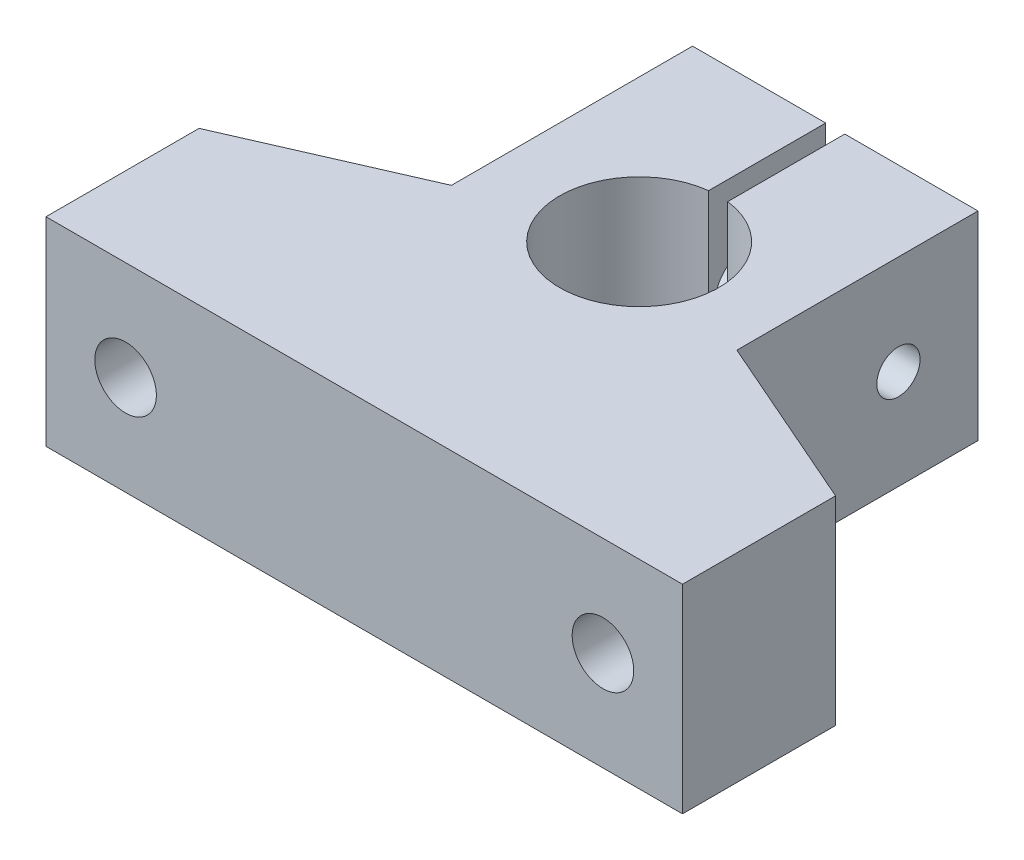
ISO-10303-21;
HEADER;
FILE_DESCRIPTION(('STEP AP214'),'2;1');
FILE_NAME('part.step','',(''),(''),'','','');
FILE_SCHEMA(('AUTOMOTIVE_DESIGN { 1 0 10303 214 1 1 1 1 }'));
ENDSEC;
DATA;
#1=APPLICATION_CONTEXT('core data for automotive mechanical design processes');
#2=APPLICATION_PROTOCOL_DEFINITION('international standard','automotive_design',2000,#1);
#3=PRODUCT_CONTEXT('',#1,'mechanical');
#4=PRODUCT('Part','Part','',(#3));
#5=PRODUCT_RELATED_PRODUCT_CATEGORY('part','',(#4));
#6=PRODUCT_DEFINITION_FORMATION('','',#4);
#7=PRODUCT_DEFINITION_CONTEXT('part definition',#1,'design');
#8=PRODUCT_DEFINITION('design','',#6,#7);
#9=PRODUCT_DEFINITION_SHAPE('','',#8);
#10=(LENGTH_UNIT() NAMED_UNIT(*) SI_UNIT(.MILLI.,.METRE.));
#11=(NAMED_UNIT(*) PLANE_ANGLE_UNIT() SI_UNIT($,.RADIAN.));
#12=(NAMED_UNIT(*) SI_UNIT($,.STERADIAN.) SOLID_ANGLE_UNIT());
#13=UNCERTAINTY_MEASURE_WITH_UNIT(LENGTH_MEASURE(1.E-05),#10,'distance_accuracy_value','');
#14=(GEOMETRIC_REPRESENTATION_CONTEXT(3) GLOBAL_UNCERTAINTY_ASSIGNED_CONTEXT((#13)) GLOBAL_UNIT_ASSIGNED_CONTEXT((#10,
#11,#12)) REPRESENTATION_CONTEXT('',''));
#15=CARTESIAN_POINT('',(0.,0.,0.));
#16=DIRECTION('',(0.,0.,1.));
#17=DIRECTION('',(1.,0.,0.));
#18=AXIS2_PLACEMENT_3D('',#15,#16,#17);
#19=CARTESIAN_POINT('',(-11.8368262810922,15.875,-27.9017324181359));
#20=DIRECTION('',(1.,0.,0.));
#21=DIRECTION('',(0.,0.,-1.));
#22=AXIS2_PLACEMENT_3D('',#19,#20,#21);
#23=PLANE('',#22);
#24=DIRECTION('',(0.,0.,1.));
#25=VECTOR('',#24,1.);
#26=CARTESIAN_POINT('',(-11.8368262810922,0.,-27.9017324181359));
#27=LINE('',#26,#25);
#28=CARTESIAN_POINT('',(-11.8368262810922,0.,-27.9017324181359));
#29=VERTEX_POINT('',#28);
#30=CARTESIAN_POINT('',(-11.8368262810922,0.,-8.65738618648675));
#31=VERTEX_POINT('',#30);
#32=EDGE_CURVE('E157',#29,#31,#27,.T.);
#33=ORIENTED_EDGE('',*,*,#32,.T.);
#34=DIRECTION('',(0.,-1.,0.));
#35=VECTOR('',#34,1.);
#36=CARTESIAN_POINT('',(-11.8368262810922,15.875,-8.65738618648675));
#37=LINE('',#36,#35);
#38=CARTESIAN_POINT('',(-11.8368262810922,15.875,-8.65738618648675));
#39=VERTEX_POINT('',#38);
#40=EDGE_CURVE('E11',#39,#31,#37,.T.);
#41=ORIENTED_EDGE('',*,*,#40,.F.);
#42=DIRECTION('',(0.,0.,1.));
#43=VECTOR('',#42,1.);
#44=CARTESIAN_POINT('',(-11.8368262810922,15.875,-27.9017324181359));
#45=LINE('',#44,#43);
#46=CARTESIAN_POINT('',(-11.8368262810922,15.875,-27.9017324181359));
#47=VERTEX_POINT('',#46);
#48=EDGE_CURVE('E180',#47,#39,#45,.T.);
#49=ORIENTED_EDGE('',*,*,#48,.F.);
#50=DIRECTION('',(0.,-1.,0.));
#51=VECTOR('',#50,1.);
#52=CARTESIAN_POINT('',(-11.8368262810922,15.875,-27.9017324181359));
#53=LINE('',#52,#51);
#54=EDGE_CURVE('E153',#47,#29,#53,.T.);
#55=ORIENTED_EDGE('',*,*,#54,.T.);
#56=EDGE_LOOP('',(#33,#41,#49,#55));
#57=FACE_BOUND('',#56,.T.);
#58=CARTESIAN_POINT('',(-11.8368262810922,7.9375,-21.5517324181359));
#59=DIRECTION('',(-1.,0.,0.));
#60=DIRECTION('',(0.,0.,1.));
#61=AXIS2_PLACEMENT_3D('',#58,#59,#60);
#62=CIRCLE('',#61,3.96875);
#63=CARTESIAN_POINT('',(-11.8368262810922,7.9375,-17.5829824181359));
#64=VERTEX_POINT('',#63);
#65=EDGE_CURVE('E205',#64,#64,#62,.T.);
#66=ORIENTED_EDGE('',*,*,#65,.F.);
#67=EDGE_LOOP('',(#66));
#68=FACE_BOUND('',#67,.T.);
#69=ADVANCED_FACE('F35',(#57,#68),#23,.F.);
#70=CARTESIAN_POINT('',(10.9469737189078,15.875,-27.9017324181359));
#71=DIRECTION('',(-1.,0.,0.));
#72=DIRECTION('',(0.,0.,1.));
#73=AXIS2_PLACEMENT_3D('',#70,#71,#72);
#74=PLANE('',#73);
#75=DIRECTION('',(0.,0.,-1.));
#76=VECTOR('',#75,1.);
#77=CARTESIAN_POINT('',(10.9469737189078,0.,-27.9017324181359));
#78=LINE('',#77,#76);
#79=CARTESIAN_POINT('',(10.9469737189078,0.,-8.65738618648675));
#80=VERTEX_POINT('',#79);
#81=CARTESIAN_POINT('',(10.9469737189078,0.,-27.9017324181359));
#82=VERTEX_POINT('',#81);
#83=EDGE_CURVE('E171',#80,#82,#78,.T.);
#84=ORIENTED_EDGE('',*,*,#83,.T.);
#85=DIRECTION('',(0.,-1.,0.));
#86=VECTOR('',#85,1.);
#87=CARTESIAN_POINT('',(10.9469737189078,15.875,-27.9017324181359));
#88=LINE('',#87,#86);
#89=CARTESIAN_POINT('',(10.9469737189078,15.875,-27.9017324181359));
#90=VERTEX_POINT('',#89);
#91=EDGE_CURVE('E187',#90,#82,#88,.T.);
#92=ORIENTED_EDGE('',*,*,#91,.F.);
#93=DIRECTION('',(0.,0.,-1.));
#94=VECTOR('',#93,1.);
#95=CARTESIAN_POINT('',(10.9469737189078,15.875,-27.9017324181359));
#96=LINE('',#95,#94);
#97=CARTESIAN_POINT('',(10.9469737189078,15.875,-8.65738618648675));
#98=VERTEX_POINT('',#97);
#99=EDGE_CURVE('E245',#98,#90,#96,.T.);
#100=ORIENTED_EDGE('',*,*,#99,.F.);
#101=DIRECTION('',(0.,-1.,0.));
#102=VECTOR('',#101,1.);
#103=CARTESIAN_POINT('',(10.9469737189078,15.875,-8.65738618648675));
#104=LINE('',#103,#102);
#105=EDGE_CURVE('E190',#98,#80,#104,.T.);
#106=ORIENTED_EDGE('',*,*,#105,.T.);
#107=EDGE_LOOP('',(#84,#92,#100,#106));
#108=FACE_BOUND('',#107,.T.);
#109=CARTESIAN_POINT('',(10.9469737189078,7.9375,-21.5517324181359));
#110=DIRECTION('',(1.,0.,0.));
#111=DIRECTION('',(0.,0.,-1.));
#112=AXIS2_PLACEMENT_3D('',#109,#110,#111);
#113=CIRCLE('',#112,1.72719999999999);
#114=CARTESIAN_POINT('',(10.9469737189078,7.9375,-23.2789324181359));
#115=VERTEX_POINT('',#114);
#116=EDGE_CURVE('E230',#115,#115,#113,.T.);
#117=ORIENTED_EDGE('',*,*,#116,.F.);
#118=EDGE_LOOP('',(#117));
#119=FACE_BOUND('',#118,.T.);
#120=ADVANCED_FACE('F278',(#108,#119),#74,.F.);
#121=CARTESIAN_POINT('',(-11.8368262810922,15.875,-8.65738618648675));
#122=DIRECTION('',(0.400932432781885,0.,0.916107627052411));
#123=DIRECTION('',(0.916107627052411,0.,-0.400932432781885));
#124=AXIS2_PLACEMENT_3D('',#121,#122,#123);
#125=PLANE('',#124);
#126=CARTESIAN_POINT('',(-19.4949262810922,7.9375,-5.30583602707377));
#127=DIRECTION('',(0.400932432781885,0.,0.916107627052411));
#128=DIRECTION('',(0.916107627052411,0.,-0.400932432781885));
#129=AXIS2_PLACEMENT_3D('',#126,#127,#128);
#130=ELLIPSE('',#129,4.33218748846083,3.96875);
#131=CARTESIAN_POINT('',(-15.5261762810922,7.9375,-7.04275049608962));
#132=VERTEX_POINT('',#131);
#133=EDGE_CURVE('E203',#132,#132,#130,.T.);
#134=ORIENTED_EDGE('',*,*,#133,.T.);
#135=EDGE_LOOP('',(#134));
#136=FACE_BOUND('',#135,.T.);
#137=DIRECTION('',(-0.916107627052411,0.,0.400932432781885));
#138=VECTOR('',#137,1.);
#139=CARTESIAN_POINT('',(-11.8368262810922,0.,-8.65738618648675));
#140=LINE('',#139,#138);
#141=CARTESIAN_POINT('',(-25.8449262810922,0.,-2.52677287664841));
#142=VERTEX_POINT('',#141);
#143=EDGE_CURVE('E160',#31,#142,#140,.T.);
#144=ORIENTED_EDGE('',*,*,#143,.T.);
#145=DIRECTION('',(0.,-1.,0.));
#146=VECTOR('',#145,1.);
#147=CARTESIAN_POINT('',(-25.8449262810922,15.875,-2.52677287664841));
#148=LINE('',#147,#146);
#149=CARTESIAN_POINT('',(-25.8449262810922,15.875,-2.52677287664841));
#150=VERTEX_POINT('',#149);
#151=EDGE_CURVE('E44',#150,#142,#148,.T.);
#152=ORIENTED_EDGE('',*,*,#151,.F.);
#153=DIRECTION('',(-0.916107627052411,0.,0.400932432781885));
#154=VECTOR('',#153,1.);
#155=CARTESIAN_POINT('',(-11.8368262810922,15.875,-8.65738618648675));
#156=LINE('',#155,#154);
#157=EDGE_CURVE('E108',#39,#150,#156,.T.);
#158=ORIENTED_EDGE('',*,*,#157,.F.);
#159=ORIENTED_EDGE('',*,*,#40,.T.);
#160=EDGE_LOOP('',(#144,#152,#158,#159));
#161=FACE_BOUND('',#160,.T.);
#162=ADVANCED_FACE('F282',(#136,#161),#125,.F.);
#163=CARTESIAN_POINT('',(-25.8449262810922,15.875,9.69026758186406));
#164=DIRECTION('',(1.,0.,0.));
#165=DIRECTION('',(0.,0.,-1.));
#166=AXIS2_PLACEMENT_3D('',#163,#164,#165);
#167=PLANE('',#166);
#168=DIRECTION('',(0.,0.,1.));
#169=VECTOR('',#168,1.);
#170=CARTESIAN_POINT('',(-25.8449262810922,0.,9.69026758186406));
#171=LINE('',#170,#169);
#172=CARTESIAN_POINT('',(-25.8449262810922,0.,9.69026758186406));
#173=VERTEX_POINT('',#172);
#174=EDGE_CURVE('E163',#142,#173,#171,.T.);
#175=ORIENTED_EDGE('',*,*,#174,.T.);
#176=DIRECTION('',(0.,-1.,0.));
#177=VECTOR('',#176,1.);
#178=CARTESIAN_POINT('',(-25.8449262810922,15.875,9.69026758186406));
#179=LINE('',#178,#177);
#180=CARTESIAN_POINT('',(-25.8449262810922,15.875,9.69026758186406));
#181=VERTEX_POINT('',#180);
#182=EDGE_CURVE('E199',#181,#173,#179,.T.);
#183=ORIENTED_EDGE('',*,*,#182,.F.);
#184=DIRECTION('',(0.,0.,1.));
#185=VECTOR('',#184,1.);
#186=CARTESIAN_POINT('',(-25.8449262810922,15.875,9.69026758186406));
#187=LINE('',#186,#185);
#188=EDGE_CURVE('E237',#150,#181,#187,.T.);
#189=ORIENTED_EDGE('',*,*,#188,.F.);
#190=ORIENTED_EDGE('',*,*,#151,.T.);
#191=EDGE_LOOP('',(#175,#183,#189,#190));
#192=FACE_BOUND('',#191,.T.);
#193=ADVANCED_FACE('F288',(#192),#167,.F.);
#194=CARTESIAN_POINT('',(-25.8449262810922,15.875,9.69026758186406));
#195=DIRECTION('',(0.,0.,-1.));
#196=DIRECTION('',(-1.,0.,0.));
#197=AXIS2_PLACEMENT_3D('',#194,#195,#196);
#198=PLANE('',#197);
#199=CARTESIAN_POINT('',(18.6050737189078,7.9375,9.69026758186406));
#200=DIRECTION('',(0.,0.,-1.));
#201=DIRECTION('',(-1.,0.,0.));
#202=AXIS2_PLACEMENT_3D('',#199,#200,#201);
#203=CIRCLE('',#202,2.45745);
#204=CARTESIAN_POINT('',(16.1476237189078,7.9375,9.69026758186406));
#205=VERTEX_POINT('',#204);
#206=EDGE_CURVE('E518',#205,#205,#203,.T.);
#207=ORIENTED_EDGE('',*,*,#206,.T.);
#208=EDGE_LOOP('',(#207));
#209=FACE_BOUND('',#208,.T.);
#210=CARTESIAN_POINT('',(-19.4949262810922,7.9375,9.69026758186406));
#211=DIRECTION('',(0.,0.,-1.));
#212=DIRECTION('',(-1.,0.,0.));
#213=AXIS2_PLACEMENT_3D('',#210,#211,#212);
#214=CIRCLE('',#213,2.45745);
#215=CARTESIAN_POINT('',(-21.9523762810922,7.9375,9.69026758186406));
#216=VERTEX_POINT('',#215);
#217=EDGE_CURVE('E206',#216,#216,#214,.T.);
#218=ORIENTED_EDGE('',*,*,#217,.T.);
#219=EDGE_LOOP('',(#218));
#220=FACE_BOUND('',#219,.T.);
#221=DIRECTION('',(1.,0.,0.));
#222=VECTOR('',#221,1.);
#223=CARTESIAN_POINT('',(-25.8449262810922,0.,9.69026758186406));
#224=LINE('',#223,#222);
#225=CARTESIAN_POINT('',(24.9550737189078,0.,9.69026758186406));
#226=VERTEX_POINT('',#225);
#227=EDGE_CURVE('E165',#173,#226,#224,.T.);
#228=ORIENTED_EDGE('',*,*,#227,.T.);
#229=DIRECTION('',(0.,-1.,0.));
#230=VECTOR('',#229,1.);
#231=CARTESIAN_POINT('',(24.9550737189078,15.875,9.69026758186406));
#232=LINE('',#231,#230);
#233=CARTESIAN_POINT('',(24.9550737189078,15.875,9.69026758186406));
#234=VERTEX_POINT('',#233);
#235=EDGE_CURVE('E196',#234,#226,#232,.T.);
#236=ORIENTED_EDGE('',*,*,#235,.F.);
#237=DIRECTION('',(1.,0.,0.));
#238=VECTOR('',#237,1.);
#239=CARTESIAN_POINT('',(-25.8449262810922,15.875,9.69026758186406));
#240=LINE('',#239,#238);
#241=EDGE_CURVE('E239',#181,#234,#240,.T.);
#242=ORIENTED_EDGE('',*,*,#241,.F.);
#243=ORIENTED_EDGE('',*,*,#182,.T.);
#244=EDGE_LOOP('',(#228,#236,#242,#243));
#245=FACE_BOUND('',#244,.T.);
#246=ADVANCED_FACE('F300',(#209,#220,#245),#198,.F.);
#247=CARTESIAN_POINT('',(24.9550737189078,15.875,9.69026758186406));
#248=DIRECTION('',(-1.,0.,0.));
#249=DIRECTION('',(0.,0.,1.));
#250=AXIS2_PLACEMENT_3D('',#247,#248,#249);
#251=PLANE('',#250);
#252=DIRECTION('',(0.,0.,-1.));
#253=VECTOR('',#252,1.);
#254=CARTESIAN_POINT('',(24.9550737189078,0.,9.69026758186406));
#255=LINE('',#254,#253);
#256=CARTESIAN_POINT('',(24.9550737189078,0.,-2.52677287664841));
#257=VERTEX_POINT('',#256);
#258=EDGE_CURVE('E167',#226,#257,#255,.T.);
#259=ORIENTED_EDGE('',*,*,#258,.T.);
#260=DIRECTION('',(0.,-1.,0.));
#261=VECTOR('',#260,1.);
#262=CARTESIAN_POINT('',(24.9550737189078,15.875,-2.52677287664841));
#263=LINE('',#262,#261);
#264=CARTESIAN_POINT('',(24.9550737189078,15.875,-2.52677287664841));
#265=VERTEX_POINT('',#264);
#266=EDGE_CURVE('E193',#265,#257,#263,.T.);
#267=ORIENTED_EDGE('',*,*,#266,.F.);
#268=DIRECTION('',(0.,0.,-1.));
#269=VECTOR('',#268,1.);
#270=CARTESIAN_POINT('',(24.9550737189078,15.875,9.69026758186406));
#271=LINE('',#270,#269);
#272=EDGE_CURVE('E241',#234,#265,#271,.T.);
#273=ORIENTED_EDGE('',*,*,#272,.F.);
#274=ORIENTED_EDGE('',*,*,#235,.T.);
#275=EDGE_LOOP('',(#259,#267,#273,#274));
#276=FACE_BOUND('',#275,.T.);
#277=ADVANCED_FACE('F296',(#276),#251,.F.);
#278=CARTESIAN_POINT('',(10.9469737189078,15.875,-8.65738618648675));
#279=DIRECTION('',(-0.400932432781885,0.,0.916107627052411));
#280=DIRECTION('',(0.916107627052411,0.,0.400932432781885));
#281=AXIS2_PLACEMENT_3D('',#278,#279,#280);
#282=PLANE('',#281);
#283=CARTESIAN_POINT('',(18.6050737189078,7.9375,-5.30583602707377));
#284=DIRECTION('',(-0.400932432781885,0.,0.916107627052411));
#285=DIRECTION('',(-0.916107627052411,0.,-0.400932432781885));
#286=AXIS2_PLACEMENT_3D('',#283,#284,#285);
#287=ELLIPSE('',#286,4.33218748846083,3.96875);
#288=CARTESIAN_POINT('',(14.6363237189078,7.9375,-7.04275049608962));
#289=VERTEX_POINT('',#288);
#290=EDGE_CURVE('E38',#289,#289,#287,.T.);
#291=ORIENTED_EDGE('',*,*,#290,.T.);
#292=EDGE_LOOP('',(#291));
#293=FACE_BOUND('',#292,.T.);
#294=DIRECTION('',(-0.916107627052411,0.,-0.400932432781885));
#295=VECTOR('',#294,1.);
#296=CARTESIAN_POINT('',(10.9469737189078,0.,-8.65738618648675));
#297=LINE('',#296,#295);
#298=EDGE_CURVE('E169',#257,#80,#297,.T.);
#299=ORIENTED_EDGE('',*,*,#298,.T.);
#300=ORIENTED_EDGE('',*,*,#105,.F.);
#301=DIRECTION('',(-0.916107627052411,0.,-0.400932432781885));
#302=VECTOR('',#301,1.);
#303=CARTESIAN_POINT('',(10.9469737189078,15.875,-8.65738618648675));
#304=LINE('',#303,#302);
#305=EDGE_CURVE('E243',#265,#98,#304,.T.);
#306=ORIENTED_EDGE('',*,*,#305,.F.);
#307=ORIENTED_EDGE('',*,*,#266,.T.);
#308=EDGE_LOOP('',(#299,#300,#306,#307));
#309=FACE_BOUND('',#308,.T.);
#310=ADVANCED_FACE('F293',(#293,#309),#282,.F.);
#311=CARTESIAN_POINT('',(0.317073718907797,15.875,-27.9017324181359));
#312=DIRECTION('',(0.,0.,1.));
#313=DIRECTION('',(1.,0.,0.));
#314=AXIS2_PLACEMENT_3D('',#311,#312,#313);
#315=PLANE('',#314);
#316=DIRECTION('',(-1.,0.,0.));
#317=VECTOR('',#316,1.);
#318=CARTESIAN_POINT('',(0.317073718907797,0.,-27.9017324181359));
#319=LINE('',#318,#317);
#320=CARTESIAN_POINT('',(0.317073718907797,0.,-27.9017324181359));
#321=VERTEX_POINT('',#320);
#322=EDGE_CURVE('E173',#82,#321,#319,.T.);
#323=ORIENTED_EDGE('',*,*,#322,.T.);
#324=DIRECTION('',(0.,-1.,0.));
#325=VECTOR('',#324,1.);
#326=CARTESIAN_POINT('',(0.317073718907797,15.875,-27.9017324181359));
#327=LINE('',#326,#325);
#328=CARTESIAN_POINT('',(0.317073718907797,15.875,-27.9017324181359));
#329=VERTEX_POINT('',#328);
#330=EDGE_CURVE('E184',#329,#321,#327,.T.);
#331=ORIENTED_EDGE('',*,*,#330,.F.);
#332=DIRECTION('',(-1.,0.,0.));
#333=VECTOR('',#332,1.);
#334=CARTESIAN_POINT('',(0.317073718907797,15.875,-27.9017324181359));
#335=LINE('',#334,#333);
#336=EDGE_CURVE('E247',#90,#329,#335,.T.);
#337=ORIENTED_EDGE('',*,*,#336,.F.);
#338=ORIENTED_EDGE('',*,*,#91,.T.);
#339=EDGE_LOOP('',(#323,#331,#337,#338));
#340=FACE_BOUND('',#339,.T.);
#341=ADVANCED_FACE('F253',(#340),#315,.F.);
#342=CARTESIAN_POINT('',(0.317073718907797,15.875,-27.9017324181359));
#343=DIRECTION('',(1.,0.,0.));
#344=DIRECTION('',(0.,0.,-1.));
#345=AXIS2_PLACEMENT_3D('',#342,#343,#344);
#346=PLANE('',#345);
#347=CARTESIAN_POINT('',(0.317073718907797,7.9375,-21.5517324181359));
#348=DIRECTION('',(1.,0.,0.));
#349=DIRECTION('',(0.,0.,-1.));
#350=AXIS2_PLACEMENT_3D('',#347,#348,#349);
#351=CIRCLE('',#350,1.72719999999999);
#352=CARTESIAN_POINT('',(0.317073718907797,7.9375,-23.2789324181359));
#353=VERTEX_POINT('',#352);
#354=EDGE_CURVE('E161',#353,#353,#351,.T.);
#355=ORIENTED_EDGE('',*,*,#354,.T.);
#356=EDGE_LOOP('',(#355));
#357=FACE_BOUND('',#356,.T.);
#358=DIRECTION('',(0.,0.,1.));
#359=VECTOR('',#358,1.);
#360=CARTESIAN_POINT('',(0.317073718907797,0.,-27.9017324181359));
#361=LINE('',#360,#359);
#362=CARTESIAN_POINT('',(0.317073718907791,0.,-18.5545324181359));
#363=VERTEX_POINT('',#362);
#364=EDGE_CURVE('E175',#321,#363,#361,.T.);
#365=ORIENTED_EDGE('',*,*,#364,.T.);
#366=DIRECTION('',(0.,-1.,0.));
#367=VECTOR('',#366,1.);
#368=CARTESIAN_POINT('',(0.317073718907791,15.875,-18.5545324181359));
#369=LINE('',#368,#367);
#370=CARTESIAN_POINT('',(0.317073718907791,15.875,-18.5545324181359));
#371=VERTEX_POINT('',#370);
#372=EDGE_CURVE('E148',#371,#363,#369,.T.);
#373=ORIENTED_EDGE('',*,*,#372,.F.);
#374=DIRECTION('',(0.,0.,1.));
#375=VECTOR('',#374,1.);
#376=CARTESIAN_POINT('',(0.317073718907797,15.875,-27.9017324181359));
#377=LINE('',#376,#375);
#378=EDGE_CURVE('E139',#329,#371,#377,.T.);
#379=ORIENTED_EDGE('',*,*,#378,.F.);
#380=ORIENTED_EDGE('',*,*,#330,.T.);
#381=EDGE_LOOP('',(#365,#373,#379,#380));
#382=FACE_BOUND('',#381,.T.);
#383=ADVANCED_FACE('F257',(#357,#382),#346,.F.);
#384=CARTESIAN_POINT('',(-0.444926281092198,15.875,-12.2504182059726));
#385=DIRECTION('',(0.,-1.,0.));
#386=DIRECTION('',(0.,0.,-1.));
#387=AXIS2_PLACEMENT_3D('',#384,#385,#386);
#388=CYLINDRICAL_SURFACE('',#387,6.35);
#389=CARTESIAN_POINT('',(-0.444926281092198,0.,-12.2504182059726));
#390=DIRECTION('',(0.,-1.,0.));
#391=DIRECTION('',(0.,0.,1.));
#392=AXIS2_PLACEMENT_3D('',#389,#390,#391);
#393=CIRCLE('',#392,6.35);
#394=CARTESIAN_POINT('',(-1.2069262810922,0.,-18.5545324181359));
#395=VERTEX_POINT('',#394);
#396=EDGE_CURVE('E147',#363,#395,#393,.T.);
#397=ORIENTED_EDGE('',*,*,#396,.T.);
#398=DIRECTION('',(0.,-1.,0.));
#399=VECTOR('',#398,1.);
#400=CARTESIAN_POINT('',(-1.2069262810922,15.875,-18.5545324181359));
#401=LINE('',#400,#399);
#402=CARTESIAN_POINT('',(-1.2069262810922,15.875,-18.5545324181359));
#403=VERTEX_POINT('',#402);
#404=EDGE_CURVE('E144',#403,#395,#401,.T.);
#405=ORIENTED_EDGE('',*,*,#404,.F.);
#406=CARTESIAN_POINT('',(-0.444926281092198,15.875,-12.2504182059726));
#407=DIRECTION('',(0.,-1.,0.));
#408=DIRECTION('',(0.,0.,1.));
#409=AXIS2_PLACEMENT_3D('',#406,#407,#408);
#410=CIRCLE('',#409,6.35);
#411=EDGE_CURVE('E133',#371,#403,#410,.T.);
#412=ORIENTED_EDGE('',*,*,#411,.F.);
#413=ORIENTED_EDGE('',*,*,#372,.T.);
#414=EDGE_LOOP('',(#397,#405,#412,#413));
#415=FACE_BOUND('',#414,.T.);
#416=ADVANCED_FACE('F145',(#415),#388,.F.);
#417=CARTESIAN_POINT('',(-1.2069262810922,15.875,-27.9017324181359));
#418=DIRECTION('',(-1.,0.,0.));
#419=DIRECTION('',(0.,0.,1.));
#420=AXIS2_PLACEMENT_3D('',#417,#418,#419);
#421=PLANE('',#420);
#422=CARTESIAN_POINT('',(-1.2069262810922,7.9375,-21.5517324181359));
#423=DIRECTION('',(-1.,0.,0.));
#424=DIRECTION('',(0.,0.,1.));
#425=AXIS2_PLACEMENT_3D('',#422,#423,#424);
#426=CIRCLE('',#425,2.45745);
#427=CARTESIAN_POINT('',(-1.2069262810922,7.9375,-19.0942824181359));
#428=VERTEX_POINT('',#427);
#429=EDGE_CURVE('E227',#428,#428,#426,.T.);
#430=ORIENTED_EDGE('',*,*,#429,.T.);
#431=EDGE_LOOP('',(#430));
#432=FACE_BOUND('',#431,.T.);
#433=DIRECTION('',(0.,0.,-1.));
#434=VECTOR('',#433,1.);
#435=CARTESIAN_POINT('',(-1.2069262810922,0.,-27.9017324181359));
#436=LINE('',#435,#434);
#437=CARTESIAN_POINT('',(-1.2069262810922,0.,-27.9017324181359));
#438=VERTEX_POINT('',#437);
#439=EDGE_CURVE('E94',#395,#438,#436,.T.);
#440=ORIENTED_EDGE('',*,*,#439,.T.);
#441=DIRECTION('',(0.,-1.,0.));
#442=VECTOR('',#441,1.);
#443=CARTESIAN_POINT('',(-1.2069262810922,15.875,-27.9017324181359));
#444=LINE('',#443,#442);
#445=CARTESIAN_POINT('',(-1.2069262810922,15.875,-27.9017324181359));
#446=VERTEX_POINT('',#445);
#447=EDGE_CURVE('E149',#446,#438,#444,.T.);
#448=ORIENTED_EDGE('',*,*,#447,.F.);
#449=DIRECTION('',(0.,0.,-1.));
#450=VECTOR('',#449,1.);
#451=CARTESIAN_POINT('',(-1.2069262810922,15.875,-27.9017324181359));
#452=LINE('',#451,#450);
#453=EDGE_CURVE('E137',#403,#446,#452,.T.);
#454=ORIENTED_EDGE('',*,*,#453,.F.);
#455=ORIENTED_EDGE('',*,*,#404,.T.);
#456=EDGE_LOOP('',(#440,#448,#454,#455));
#457=FACE_BOUND('',#456,.T.);
#458=ADVANCED_FACE('F151',(#432,#457),#421,.F.);
#459=CARTESIAN_POINT('',(-11.8368262810922,15.875,-27.9017324181359));
#460=DIRECTION('',(0.,0.,1.));
#461=DIRECTION('',(1.,0.,0.));
#462=AXIS2_PLACEMENT_3D('',#459,#460,#461);
#463=PLANE('',#462);
#464=DIRECTION('',(-1.,0.,0.));
#465=VECTOR('',#464,1.);
#466=CARTESIAN_POINT('',(-11.8368262810922,0.,-27.9017324181359));
#467=LINE('',#466,#465);
#468=EDGE_CURVE('E100',#438,#29,#467,.T.);
#469=ORIENTED_EDGE('',*,*,#468,.T.);
#470=ORIENTED_EDGE('',*,*,#54,.F.);
#471=DIRECTION('',(-1.,0.,0.));
#472=VECTOR('',#471,1.);
#473=CARTESIAN_POINT('',(-11.8368262810922,15.875,-27.9017324181359));
#474=LINE('',#473,#472);
#475=EDGE_CURVE('E53',#446,#47,#474,.T.);
#476=ORIENTED_EDGE('',*,*,#475,.F.);
#477=ORIENTED_EDGE('',*,*,#447,.T.);
#478=EDGE_LOOP('',(#469,#470,#476,#477));
#479=FACE_BOUND('',#478,.T.);
#480=ADVANCED_FACE('F266',(#479),#463,.F.);
#481=CARTESIAN_POINT('',(-0.444926281092198,15.875,-12.2504182059726));
#482=DIRECTION('',(0.,1.,0.));
#483=DIRECTION('',(0.,0.,1.));
#484=AXIS2_PLACEMENT_3D('',#481,#482,#483);
#485=PLANE('',#484);
#486=ORIENTED_EDGE('',*,*,#48,.T.);
#487=ORIENTED_EDGE('',*,*,#157,.T.);
#488=ORIENTED_EDGE('',*,*,#188,.T.);
#489=ORIENTED_EDGE('',*,*,#241,.T.);
#490=ORIENTED_EDGE('',*,*,#272,.T.);
#491=ORIENTED_EDGE('',*,*,#305,.T.);
#492=ORIENTED_EDGE('',*,*,#99,.T.);
#493=ORIENTED_EDGE('',*,*,#336,.T.);
#494=ORIENTED_EDGE('',*,*,#378,.T.);
#495=ORIENTED_EDGE('',*,*,#411,.T.);
#496=ORIENTED_EDGE('',*,*,#453,.T.);
#497=ORIENTED_EDGE('',*,*,#475,.T.);
#498=EDGE_LOOP('',(#486,#487,#488,#489,#490,#491,#492,#493,#494,#495,#496,#497));
#499=FACE_BOUND('',#498,.T.);
#500=ADVANCED_FACE('F135',(#499),#485,.T.);
#501=CARTESIAN_POINT('',(-0.444926281092198,0.,-12.2504182059726));
#502=DIRECTION('',(0.,1.,0.));
#503=DIRECTION('',(0.,0.,1.));
#504=AXIS2_PLACEMENT_3D('',#501,#502,#503);
#505=PLANE('',#504);
#506=ORIENTED_EDGE('',*,*,#32,.F.);
#507=ORIENTED_EDGE('',*,*,#468,.F.);
#508=ORIENTED_EDGE('',*,*,#439,.F.);
#509=ORIENTED_EDGE('',*,*,#396,.F.);
#510=ORIENTED_EDGE('',*,*,#364,.F.);
#511=ORIENTED_EDGE('',*,*,#322,.F.);
#512=ORIENTED_EDGE('',*,*,#83,.F.);
#513=ORIENTED_EDGE('',*,*,#298,.F.);
#514=ORIENTED_EDGE('',*,*,#258,.F.);
#515=ORIENTED_EDGE('',*,*,#227,.F.);
#516=ORIENTED_EDGE('',*,*,#174,.F.);
#517=ORIENTED_EDGE('',*,*,#143,.F.);
#518=EDGE_LOOP('',(#506,#507,#508,#509,#510,#511,#512,#513,#514,#515,#516,#517));
#519=FACE_BOUND('',#518,.T.);
#520=ADVANCED_FACE('F260',(#519),#505,.F.);
#521=CARTESIAN_POINT('',(10.9469737189078,7.9375,-21.5517324181359));
#522=DIRECTION('',(1.,0.,0.));
#523=DIRECTION('',(0.,0.,-1.));
#524=AXIS2_PLACEMENT_3D('',#521,#522,#523);
#525=CYLINDRICAL_SURFACE('',#524,1.72719999999999);
#526=ORIENTED_EDGE('',*,*,#354,.F.);
#527=EDGE_LOOP('',(#526));
#528=FACE_BOUND('',#527,.T.);
#529=ORIENTED_EDGE('',*,*,#116,.T.);
#530=EDGE_LOOP('',(#529));
#531=FACE_BOUND('',#530,.T.);
#532=ADVANCED_FACE('F374',(#528,#531),#525,.F.);
#533=CARTESIAN_POINT('',(-11.8368262810922,7.9375,-21.5517324181359));
#534=DIRECTION('',(-1.,0.,0.));
#535=DIRECTION('',(0.,0.,1.));
#536=AXIS2_PLACEMENT_3D('',#533,#534,#535);
#537=CYLINDRICAL_SURFACE('',#536,2.45745);
#538=ORIENTED_EDGE('',*,*,#429,.F.);
#539=EDGE_LOOP('',(#538));
#540=FACE_BOUND('',#539,.T.);
#541=CARTESIAN_POINT('',(-7.6712262810922,7.9375,-21.5517324181359));
#542=DIRECTION('',(-1.,0.,0.));
#543=DIRECTION('',(0.,0.,1.));
#544=AXIS2_PLACEMENT_3D('',#541,#542,#543);
#545=CIRCLE('',#544,2.45745);
#546=CARTESIAN_POINT('',(-7.6712262810922,7.9375,-19.0942824181359));
#547=VERTEX_POINT('',#546);
#548=EDGE_CURVE('E224',#547,#547,#545,.T.);
#549=ORIENTED_EDGE('',*,*,#548,.T.);
#550=EDGE_LOOP('',(#549));
#551=FACE_BOUND('',#550,.T.);
#552=ADVANCED_FACE('F368',(#540,#551),#537,.F.);
#553=CARTESIAN_POINT('',(-7.6712262810922,10.39495,-21.5517324181359));
#554=DIRECTION('',(1.,0.,0.));
#555=DIRECTION('',(0.,0.,-1.));
#556=AXIS2_PLACEMENT_3D('',#553,#554,#555);
#557=PLANE('',#556);
#558=ORIENTED_EDGE('',*,*,#548,.F.);
#559=EDGE_LOOP('',(#558));
#560=FACE_BOUND('',#559,.T.);
#561=CARTESIAN_POINT('',(-7.6712262810922,7.9375,-21.5517324181359));
#562=DIRECTION('',(-1.,0.,0.));
#563=DIRECTION('',(0.,0.,1.));
#564=AXIS2_PLACEMENT_3D('',#561,#562,#563);
#565=CIRCLE('',#564,3.96875);
#566=CARTESIAN_POINT('',(-7.6712262810922,7.9375,-17.5829824181359));
#567=VERTEX_POINT('',#566);
#568=EDGE_CURVE('E210',#567,#567,#565,.T.);
#569=ORIENTED_EDGE('',*,*,#568,.T.);
#570=EDGE_LOOP('',(#569));
#571=FACE_BOUND('',#570,.T.);
#572=ADVANCED_FACE('F373',(#560,#571),#557,.F.);
#573=CARTESIAN_POINT('',(-11.8368262810922,7.9375,-21.5517324181359));
#574=DIRECTION('',(-1.,0.,0.));
#575=DIRECTION('',(0.,0.,1.));
#576=AXIS2_PLACEMENT_3D('',#573,#574,#575);
#577=CYLINDRICAL_SURFACE('',#576,3.96875);
#578=ORIENTED_EDGE('',*,*,#568,.F.);
#579=EDGE_LOOP('',(#578));
#580=FACE_BOUND('',#579,.T.);
#581=ORIENTED_EDGE('',*,*,#65,.T.);
#582=EDGE_LOOP('',(#581));
#583=FACE_BOUND('',#582,.T.);
#584=ADVANCED_FACE('F385',(#580,#583),#577,.F.);
#585=CARTESIAN_POINT('',(-19.4949262810922,7.9375,-8.65738618648675));
#586=DIRECTION('',(0.,0.,-1.));
#587=DIRECTION('',(-1.,0.,0.));
#588=AXIS2_PLACEMENT_3D('',#585,#586,#587);
#589=CYLINDRICAL_SURFACE('',#588,3.96875);
#590=CARTESIAN_POINT('',(-19.4949262810922,7.9375,1.85821381351325));
#591=DIRECTION('',(0.,0.,-1.));
#592=DIRECTION('',(-1.,0.,0.));
#593=AXIS2_PLACEMENT_3D('',#590,#591,#592);
#594=CIRCLE('',#593,3.96875);
#595=CARTESIAN_POINT('',(-23.4636762810922,7.9375,1.85821381351325));
#596=VERTEX_POINT('',#595);
#597=EDGE_CURVE('E218',#596,#596,#594,.T.);
#598=ORIENTED_EDGE('',*,*,#597,.F.);
#599=EDGE_LOOP('',(#598));
#600=FACE_BOUND('',#599,.T.);
#601=ORIENTED_EDGE('',*,*,#133,.F.);
#602=EDGE_LOOP('',(#601));
#603=FACE_BOUND('',#602,.T.);
#604=ADVANCED_FACE('F394',(#600,#603),#589,.F.);
#605=CARTESIAN_POINT('',(-19.4949262810922,7.9375,-8.65738618648675));
#606=DIRECTION('',(0.,0.,-1.));
#607=DIRECTION('',(-1.,0.,0.));
#608=AXIS2_PLACEMENT_3D('',#605,#606,#607);
#609=CYLINDRICAL_SURFACE('',#608,2.45745);
#610=ORIENTED_EDGE('',*,*,#217,.F.);
#611=EDGE_LOOP('',(#610));
#612=FACE_BOUND('',#611,.T.);
#613=CARTESIAN_POINT('',(-19.4949262810922,7.9375,1.85821381351325));
#614=DIRECTION('',(0.,0.,-1.));
#615=DIRECTION('',(-1.,0.,0.));
#616=AXIS2_PLACEMENT_3D('',#613,#614,#615);
#617=CIRCLE('',#616,2.45745);
#618=CARTESIAN_POINT('',(-21.9523762810922,7.9375,1.85821381351325));
#619=VERTEX_POINT('',#618);
#620=EDGE_CURVE('E213',#619,#619,#617,.T.);
#621=ORIENTED_EDGE('',*,*,#620,.T.);
#622=EDGE_LOOP('',(#621));
#623=FACE_BOUND('',#622,.T.);
#624=ADVANCED_FACE('F422',(#612,#623),#609,.F.);
#625=CARTESIAN_POINT('',(-17.0374762810922,7.9375,1.85821381351325));
#626=DIRECTION('',(0.,0.,1.));
#627=DIRECTION('',(1.,0.,0.));
#628=AXIS2_PLACEMENT_3D('',#625,#626,#627);
#629=PLANE('',#628);
#630=ORIENTED_EDGE('',*,*,#620,.F.);
#631=EDGE_LOOP('',(#630));
#632=FACE_BOUND('',#631,.T.);
#633=ORIENTED_EDGE('',*,*,#597,.T.);
#634=EDGE_LOOP('',(#633));
#635=FACE_BOUND('',#634,.T.);
#636=ADVANCED_FACE('F429',(#632,#635),#629,.F.);
#637=CARTESIAN_POINT('',(18.6050737189078,7.9375,-8.65738618648675));
#638=DIRECTION('',(0.,0.,-1.));
#639=DIRECTION('',(-1.,0.,0.));
#640=AXIS2_PLACEMENT_3D('',#637,#638,#639);
#641=CYLINDRICAL_SURFACE('',#640,3.96875);
#642=CARTESIAN_POINT('',(18.6050737189078,7.9375,1.85821381351325));
#643=DIRECTION('',(0.,0.,-1.));
#644=DIRECTION('',(-1.,0.,0.));
#645=AXIS2_PLACEMENT_3D('',#642,#643,#644);
#646=CIRCLE('',#645,3.96875);
#647=CARTESIAN_POINT('',(14.6363237189078,7.9375,1.85821381351325));
#648=VERTEX_POINT('',#647);
#649=EDGE_CURVE('E516',#648,#648,#646,.T.);
#650=ORIENTED_EDGE('',*,*,#649,.F.);
#651=EDGE_LOOP('',(#650));
#652=FACE_BOUND('',#651,.T.);
#653=ORIENTED_EDGE('',*,*,#290,.F.);
#654=EDGE_LOOP('',(#653));
#655=FACE_BOUND('',#654,.T.);
#656=ADVANCED_FACE('F437',(#652,#655),#641,.F.);
#657=CARTESIAN_POINT('',(18.6050737189078,7.9375,-8.65738618648675));
#658=DIRECTION('',(0.,0.,-1.));
#659=DIRECTION('',(-1.,0.,0.));
#660=AXIS2_PLACEMENT_3D('',#657,#658,#659);
#661=CYLINDRICAL_SURFACE('',#660,2.45745);
#662=ORIENTED_EDGE('',*,*,#206,.F.);
#663=EDGE_LOOP('',(#662));
#664=FACE_BOUND('',#663,.T.);
#665=CARTESIAN_POINT('',(18.6050737189078,7.9375,1.85821381351325));
#666=DIRECTION('',(0.,0.,-1.));
#667=DIRECTION('',(-1.,0.,0.));
#668=AXIS2_PLACEMENT_3D('',#665,#666,#667);
#669=CIRCLE('',#668,2.45745);
#670=CARTESIAN_POINT('',(16.1476237189078,7.9375,1.85821381351325));
#671=VERTEX_POINT('',#670);
#672=EDGE_CURVE('E513',#671,#671,#669,.T.);
#673=ORIENTED_EDGE('',*,*,#672,.T.);
#674=EDGE_LOOP('',(#673));
#675=FACE_BOUND('',#674,.T.);
#676=ADVANCED_FACE('F445',(#664,#675),#661,.F.);
#677=CARTESIAN_POINT('',(21.0625237189078,7.9375,1.85821381351325));
#678=DIRECTION('',(0.,0.,1.));
#679=DIRECTION('',(1.,0.,0.));
#680=AXIS2_PLACEMENT_3D('',#677,#678,#679);
#681=PLANE('',#680);
#682=ORIENTED_EDGE('',*,*,#672,.F.);
#683=EDGE_LOOP('',(#682));
#684=FACE_BOUND('',#683,.T.);
#685=ORIENTED_EDGE('',*,*,#649,.T.);
#686=EDGE_LOOP('',(#685));
#687=FACE_BOUND('',#686,.T.);
#688=ADVANCED_FACE('F453',(#684,#687),#681,.F.);
#689=CLOSED_SHELL('',(#69,#120,#162,#193,#246,#277,#310,#341,#383,#416,#458,#480,#500,#520,#532,
#552,#572,#584,#604,#624,#636,#656,#676,#688));
#690=MANIFOLD_SOLID_BREP('B2',#689);
#691=ADVANCED_BREP_SHAPE_REPRESENTATION('',(#18,#690),#14);
#692=SHAPE_DEFINITION_REPRESENTATION(#9,#691);
ENDSEC;
END-ISO-10303-21;
